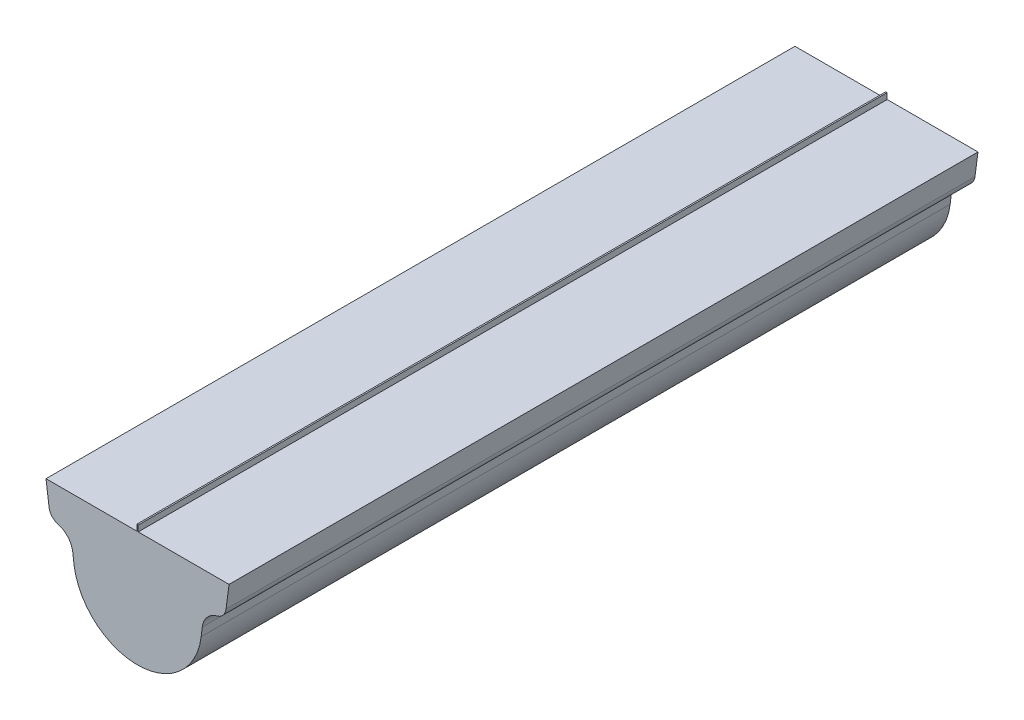
ISO-10303-21;
HEADER;
FILE_DESCRIPTION(('STEP AP214'),'2;1');
FILE_NAME('part.step','',(''),(''),'','','');
FILE_SCHEMA(('AUTOMOTIVE_DESIGN { 1 0 10303 214 1 1 1 1 }'));
ENDSEC;
DATA;
#1=APPLICATION_CONTEXT('core data for automotive mechanical design processes');
#2=APPLICATION_PROTOCOL_DEFINITION('international standard','automotive_design',2000,#1);
#3=PRODUCT_CONTEXT('',#1,'mechanical');
#4=PRODUCT('Part','Part','',(#3));
#5=PRODUCT_RELATED_PRODUCT_CATEGORY('part','',(#4));
#6=PRODUCT_DEFINITION_FORMATION('','',#4);
#7=PRODUCT_DEFINITION_CONTEXT('part definition',#1,'design');
#8=PRODUCT_DEFINITION('design','',#6,#7);
#9=PRODUCT_DEFINITION_SHAPE('','',#8);
#10=(LENGTH_UNIT() NAMED_UNIT(*) SI_UNIT(.MILLI.,.METRE.));
#11=(NAMED_UNIT(*) PLANE_ANGLE_UNIT() SI_UNIT($,.RADIAN.));
#12=(NAMED_UNIT(*) SI_UNIT($,.STERADIAN.) SOLID_ANGLE_UNIT());
#13=UNCERTAINTY_MEASURE_WITH_UNIT(LENGTH_MEASURE(1.E-05),#10,'distance_accuracy_value','');
#14=(GEOMETRIC_REPRESENTATION_CONTEXT(3) GLOBAL_UNCERTAINTY_ASSIGNED_CONTEXT((#13)) GLOBAL_UNIT_ASSIGNED_CONTEXT((#10,
#11,#12)) REPRESENTATION_CONTEXT('',''));
#15=CARTESIAN_POINT('',(0.,0.,0.));
#16=DIRECTION('',(0.,0.,1.));
#17=DIRECTION('',(1.,0.,0.));
#18=AXIS2_PLACEMENT_3D('',#15,#16,#17);
#19=CARTESIAN_POINT('',(-3.38742569697851,-0.0519080876537091,15.));
#20=DIRECTION('',(0.,0.,-1.));
#21=DIRECTION('',(-1.,0.,0.));
#22=AXIS2_PLACEMENT_3D('',#19,#20,#21);
#23=CYLINDRICAL_SURFACE('',#22,0.800000000000125);
#24=CARTESIAN_POINT('',(-3.38742569697851,-0.0519080876537091,15.));
#25=DIRECTION('',(0.,0.,-1.));
#26=DIRECTION('',(1.,0.,0.));
#27=AXIS2_PLACEMENT_3D('',#24,#25,#26);
#28=CIRCLE('',#27,0.800000000000125);
#29=CARTESIAN_POINT('',(-3.17867999402172,0.720377631168849,15.));
#30=VERTEX_POINT('',#29);
#31=CARTESIAN_POINT('',(-2.59341523450823,0.0458026358516489,15.));
#32=VERTEX_POINT('',#31);
#33=EDGE_CURVE('E167',#30,#32,#28,.T.);
#34=ORIENTED_EDGE('',*,*,#33,.F.);
#35=DIRECTION('',(0.,0.,-1.));
#36=VECTOR('',#35,1.);
#37=CARTESIAN_POINT('',(-3.17867999402172,0.720377631168849,15.));
#38=LINE('',#37,#36);
#39=CARTESIAN_POINT('',(-3.17867999402172,0.720377631168849,-15.));
#40=VERTEX_POINT('',#39);
#41=EDGE_CURVE('E196',#30,#40,#38,.T.);
#42=ORIENTED_EDGE('',*,*,#41,.T.);
#43=CARTESIAN_POINT('',(-3.38742569697851,-0.0519080876537091,-15.));
#44=DIRECTION('',(0.,0.,-1.));
#45=DIRECTION('',(1.,0.,0.));
#46=AXIS2_PLACEMENT_3D('',#43,#44,#45);
#47=CIRCLE('',#46,0.800000000000125);
#48=CARTESIAN_POINT('',(-2.59341523450823,0.0458026358516489,-15.));
#49=VERTEX_POINT('',#48);
#50=EDGE_CURVE('E193',#40,#49,#47,.T.);
#51=ORIENTED_EDGE('',*,*,#50,.T.);
#52=DIRECTION('',(0.,0.,-1.));
#53=VECTOR('',#52,1.);
#54=CARTESIAN_POINT('',(-2.59341523450823,0.0458026358516489,15.));
#55=LINE('',#54,#53);
#56=EDGE_CURVE('E185',#32,#49,#55,.T.);
#57=ORIENTED_EDGE('',*,*,#56,.F.);
#58=EDGE_LOOP('',(#34,#42,#51,#57));
#59=FACE_BOUND('',#58,.T.);
#60=ADVANCED_FACE('F39',(#59),#23,.F.);
#61=CARTESIAN_POINT('',(-2.59341523450823,0.0458026358516489,15.));
#62=DIRECTION('',(0.992513078087688,0.122138404381679,0.));
#63=DIRECTION('',(-0.122138404381679,0.992513078087688,0.));
#64=AXIS2_PLACEMENT_3D('',#61,#62,#63);
#65=PLANE('',#64);
#66=DIRECTION('',(0.122138404381679,-0.992513078087688,0.));
#67=VECTOR('',#66,1.);
#68=CARTESIAN_POINT('',(-2.59341523450823,0.0458026358516489,-15.));
#69=LINE('',#68,#67);
#70=CARTESIAN_POINT('',(-2.53832302564794,-0.401884052634221,-15.));
#71=VERTEX_POINT('',#70);
#72=EDGE_CURVE('E303',#49,#71,#69,.T.);
#73=ORIENTED_EDGE('',*,*,#72,.T.);
#74=DIRECTION('',(0.,0.,-1.));
#75=VECTOR('',#74,1.);
#76=CARTESIAN_POINT('',(-2.53832302564794,-0.401884052634221,15.));
#77=LINE('',#76,#75);
#78=CARTESIAN_POINT('',(-2.53832302564794,-0.401884052634221,15.));
#79=VERTEX_POINT('',#78);
#80=EDGE_CURVE('E187',#79,#71,#77,.T.);
#81=ORIENTED_EDGE('',*,*,#80,.F.);
#82=DIRECTION('',(0.122138404381679,-0.992513078087688,0.));
#83=VECTOR('',#82,1.);
#84=CARTESIAN_POINT('',(-2.59341523450823,0.0458026358516489,15.));
#85=LINE('',#84,#83);
#86=EDGE_CURVE('E171',#32,#79,#85,.T.);
#87=ORIENTED_EDGE('',*,*,#86,.F.);
#88=ORIENTED_EDGE('',*,*,#56,.T.);
#89=EDGE_LOOP('',(#73,#81,#87,#88));
#90=FACE_BOUND('',#89,.T.);
#91=ADVANCED_FACE('F184',(#90),#65,.F.);
#92=CARTESIAN_POINT('',(6.01650986206519E-05,-1.84460906226725E-08,15.));
#93=DIRECTION('',(0.,0.,-1.));
#94=DIRECTION('',(-1.,0.,0.));
#95=AXIS2_PLACEMENT_3D('',#92,#93,#94);
#96=CYLINDRICAL_SURFACE('',#95,2.57);
#97=CARTESIAN_POINT('',(6.01650986206519E-05,-1.84460906226725E-08,-15.));
#98=DIRECTION('',(0.,0.,1.));
#99=DIRECTION('',(1.,0.,0.));
#100=AXIS2_PLACEMENT_3D('',#97,#98,#99);
#101=CIRCLE('',#100,2.57);
#102=CARTESIAN_POINT('',(2.55098858639411,-0.312512721270984,-15.));
#103=VERTEX_POINT('',#102);
#104=EDGE_CURVE('E301',#71,#103,#101,.T.);
#105=ORIENTED_EDGE('',*,*,#104,.T.);
#106=DIRECTION('',(0.,0.,-1.));
#107=VECTOR('',#106,1.);
#108=CARTESIAN_POINT('',(2.55098858639411,-0.312512721270984,15.));
#109=LINE('',#108,#107);
#110=CARTESIAN_POINT('',(2.55098858639411,-0.312512721270984,15.));
#111=VERTEX_POINT('',#110);
#112=EDGE_CURVE('E202',#111,#103,#109,.T.);
#113=ORIENTED_EDGE('',*,*,#112,.F.);
#114=CARTESIAN_POINT('',(6.01650986206519E-05,-1.84460906226725E-08,15.));
#115=DIRECTION('',(0.,0.,1.));
#116=DIRECTION('',(1.,0.,0.));
#117=AXIS2_PLACEMENT_3D('',#114,#115,#116);
#118=CIRCLE('',#117,2.57);
#119=EDGE_CURVE('E190',#79,#111,#118,.T.);
#120=ORIENTED_EDGE('',*,*,#119,.F.);
#121=ORIENTED_EDGE('',*,*,#80,.T.);
#122=EDGE_LOOP('',(#105,#113,#120,#121));
#123=FACE_BOUND('',#122,.T.);
#124=ADVANCED_FACE('F333',(#123),#96,.T.);
#125=CARTESIAN_POINT('',(2.55098858639411,-0.312512721270984,15.));
#126=DIRECTION('',(-0.992579152255181,0.121600273471676,0.));
#127=DIRECTION('',(-0.121600273471676,-0.992579152255181,0.));
#128=AXIS2_PLACEMENT_3D('',#125,#126,#127);
#129=PLANE('',#128);
#130=DIRECTION('',(0.121600273471676,0.992579152255181,0.));
#131=VECTOR('',#130,1.);
#132=CARTESIAN_POINT('',(2.55098858639411,-0.312512721270984,-15.));
#133=LINE('',#132,#131);
#134=CARTESIAN_POINT('',(2.59483284387605,0.0453721311246856,-15.));
#135=VERTEX_POINT('',#134);
#136=EDGE_CURVE('E243',#103,#135,#133,.T.);
#137=ORIENTED_EDGE('',*,*,#136,.T.);
#138=DIRECTION('',(0.,0.,-1.));
#139=VECTOR('',#138,1.);
#140=CARTESIAN_POINT('',(2.59483284387605,0.0453721311246856,15.));
#141=LINE('',#140,#139);
#142=CARTESIAN_POINT('',(2.59483284387605,0.0453721311246856,15.));
#143=VERTEX_POINT('',#142);
#144=EDGE_CURVE('E286',#143,#135,#141,.T.);
#145=ORIENTED_EDGE('',*,*,#144,.F.);
#146=DIRECTION('',(0.121600273471676,0.992579152255181,0.));
#147=VECTOR('',#146,1.);
#148=CARTESIAN_POINT('',(2.55098858639411,-0.312512721270984,15.));
#149=LINE('',#148,#147);
#150=EDGE_CURVE('E298',#111,#143,#149,.T.);
#151=ORIENTED_EDGE('',*,*,#150,.F.);
#152=ORIENTED_EDGE('',*,*,#112,.T.);
#153=EDGE_LOOP('',(#137,#145,#151,#152));
#154=FACE_BOUND('',#153,.T.);
#155=ADVANCED_FACE('F296',(#154),#129,.F.);
#156=CARTESIAN_POINT('',(3.38889616568016,-0.0519080876534886,15.));
#157=DIRECTION('',(0.,0.,-1.));
#158=DIRECTION('',(-1.,0.,0.));
#159=AXIS2_PLACEMENT_3D('',#156,#157,#158);
#160=CYLINDRICAL_SURFACE('',#159,0.800000000000069);
#161=CARTESIAN_POINT('',(3.38889616568016,-0.0519080876534886,-15.));
#162=DIRECTION('',(0.,0.,-1.));
#163=DIRECTION('',(1.,0.,0.));
#164=AXIS2_PLACEMENT_3D('',#161,#162,#163);
#165=CIRCLE('',#164,0.800000000000069);
#166=CARTESIAN_POINT('',(3.18015046256572,0.7203776311264,-15.));
#167=VERTEX_POINT('',#166);
#168=EDGE_CURVE('E236',#135,#167,#165,.T.);
#169=ORIENTED_EDGE('',*,*,#168,.T.);
#170=DIRECTION('',(0.,0.,-1.));
#171=VECTOR('',#170,1.);
#172=CARTESIAN_POINT('',(3.18015046256572,0.7203776311264,15.));
#173=LINE('',#172,#171);
#174=CARTESIAN_POINT('',(3.18015046256572,0.7203776311264,15.));
#175=VERTEX_POINT('',#174);
#176=EDGE_CURVE('E11',#167,#175,#173,.F.);
#177=ORIENTED_EDGE('',*,*,#176,.T.);
#178=CARTESIAN_POINT('',(3.38889616568016,-0.0519080876534886,15.));
#179=DIRECTION('',(0.,0.,-1.));
#180=DIRECTION('',(1.,0.,0.));
#181=AXIS2_PLACEMENT_3D('',#178,#179,#180);
#182=CIRCLE('',#181,0.800000000000069);
#183=EDGE_CURVE('E328',#143,#175,#182,.T.);
#184=ORIENTED_EDGE('',*,*,#183,.F.);
#185=ORIENTED_EDGE('',*,*,#144,.T.);
#186=EDGE_LOOP('',(#169,#177,#184,#185));
#187=FACE_BOUND('',#186,.T.);
#188=ADVANCED_FACE('F340',(#187),#160,.F.);
#189=CARTESIAN_POINT('',(3.49324079305458,0.741257846270935,15.));
#190=DIRECTION('',(-0.991457417380456,0.130430784407962,0.));
#191=DIRECTION('',(-0.130430784407962,-0.991457417380456,0.));
#192=AXIS2_PLACEMENT_3D('',#189,#190,#191);
#193=PLANE('',#192);
#194=DIRECTION('',(0.130430784407962,0.991457417380456,0.));
#195=VECTOR('',#194,1.);
#196=CARTESIAN_POINT('',(3.49324079305458,0.741257846270935,15.));
#197=LINE('',#196,#195);
#198=CARTESIAN_POINT('',(3.54541310680944,1.13784081315981,15.));
#199=VERTEX_POINT('',#198);
#200=CARTESIAN_POINT('',(3.66671373631566,2.05989621137545,15.));
#201=VERTEX_POINT('',#200);
#202=EDGE_CURVE('E227',#199,#201,#197,.T.);
#203=ORIENTED_EDGE('',*,*,#202,.F.);
#204=DIRECTION('',(0.,0.,-1.));
#205=VECTOR('',#204,1.);
#206=CARTESIAN_POINT('',(3.54541310680944,1.13784081315981,15.));
#207=LINE('',#206,#205);
#208=CARTESIAN_POINT('',(3.54541310680944,1.13784081315981,-15.));
#209=VERTEX_POINT('',#208);
#210=EDGE_CURVE('E48',#199,#209,#207,.T.);
#211=ORIENTED_EDGE('',*,*,#210,.T.);
#212=DIRECTION('',(0.130430784407962,0.991457417380456,0.));
#213=VECTOR('',#212,1.);
#214=CARTESIAN_POINT('',(3.49324079305458,0.741257846270935,-15.));
#215=LINE('',#214,#213);
#216=CARTESIAN_POINT('',(3.66671373631566,2.05989621137545,-15.));
#217=VERTEX_POINT('',#216);
#218=EDGE_CURVE('E225',#209,#217,#215,.T.);
#219=ORIENTED_EDGE('',*,*,#218,.T.);
#220=DIRECTION('',(0.,0.,-1.));
#221=VECTOR('',#220,1.);
#222=CARTESIAN_POINT('',(3.66671373631566,2.05989621137545,15.));
#223=LINE('',#222,#221);
#224=EDGE_CURVE('E283',#201,#217,#223,.T.);
#225=ORIENTED_EDGE('',*,*,#224,.F.);
#226=EDGE_LOOP('',(#203,#211,#219,#225));
#227=FACE_BOUND('',#226,.T.);
#228=ADVANCED_FACE('F223',(#227),#193,.F.);
#229=CARTESIAN_POINT('',(0.0289371754169424,2.05989621137086,15.));
#230=DIRECTION('',(1.26106597132159E-12,-1.,0.));
#231=DIRECTION('',(1.,1.26106597132159E-12,0.));
#232=AXIS2_PLACEMENT_3D('',#229,#230,#231);
#233=PLANE('',#232);
#234=DIRECTION('',(-1.,-1.26106597132159E-12,0.));
#235=VECTOR('',#234,1.);
#236=CARTESIAN_POINT('',(0.0289371754169424,2.05989621137086,-15.));
#237=LINE('',#236,#235);
#238=CARTESIAN_POINT('',(0.0289371754169424,2.05989621137086,-15.));
#239=VERTEX_POINT('',#238);
#240=EDGE_CURVE('E234',#217,#239,#237,.T.);
#241=ORIENTED_EDGE('',*,*,#240,.T.);
#242=DIRECTION('',(0.,0.,-1.));
#243=VECTOR('',#242,1.);
#244=CARTESIAN_POINT('',(0.0289371754169424,2.05989621137086,15.));
#245=LINE('',#244,#243);
#246=CARTESIAN_POINT('',(0.0289371754169424,2.05989621137086,15.));
#247=VERTEX_POINT('',#246);
#248=EDGE_CURVE('E279',#247,#239,#245,.T.);
#249=ORIENTED_EDGE('',*,*,#248,.F.);
#250=DIRECTION('',(-1.,-1.26106597132159E-12,0.));
#251=VECTOR('',#250,1.);
#252=CARTESIAN_POINT('',(0.0289371754169424,2.05989621137086,15.));
#253=LINE('',#252,#251);
#254=EDGE_CURVE('E324',#201,#247,#253,.T.);
#255=ORIENTED_EDGE('',*,*,#254,.F.);
#256=ORIENTED_EDGE('',*,*,#224,.T.);
#257=EDGE_LOOP('',(#241,#249,#255,#256));
#258=FACE_BOUND('',#257,.T.);
#259=ADVANCED_FACE('F381',(#258),#233,.F.);
#260=CARTESIAN_POINT('',(0.0289371754169424,2.25871257688882,15.));
#261=DIRECTION('',(-1.,0.,0.));
#262=DIRECTION('',(0.,0.,1.));
#263=AXIS2_PLACEMENT_3D('',#260,#261,#262);
#264=PLANE('',#263);
#265=DIRECTION('',(0.,1.,0.));
#266=VECTOR('',#265,1.);
#267=CARTESIAN_POINT('',(0.0289371754169424,2.25871257688882,-15.));
#268=LINE('',#267,#266);
#269=CARTESIAN_POINT('',(0.0289371754169424,2.2999858416259,-15.));
#270=VERTEX_POINT('',#269);
#271=EDGE_CURVE('E240',#239,#270,#268,.T.);
#272=ORIENTED_EDGE('',*,*,#271,.T.);
#273=DIRECTION('',(0.,0.,-1.));
#274=VECTOR('',#273,1.);
#275=CARTESIAN_POINT('',(0.0289371754169424,2.2999858416259,15.));
#276=LINE('',#275,#274);
#277=CARTESIAN_POINT('',(0.0289371754169424,2.2999858416259,15.));
#278=VERTEX_POINT('',#277);
#279=EDGE_CURVE('E275',#278,#270,#276,.T.);
#280=ORIENTED_EDGE('',*,*,#279,.F.);
#281=DIRECTION('',(0.,1.,0.));
#282=VECTOR('',#281,1.);
#283=CARTESIAN_POINT('',(0.0289371754169424,2.25871257688882,15.));
#284=LINE('',#283,#282);
#285=EDGE_CURVE('E321',#247,#278,#284,.T.);
#286=ORIENTED_EDGE('',*,*,#285,.F.);
#287=ORIENTED_EDGE('',*,*,#248,.T.);
#288=EDGE_LOOP('',(#272,#280,#286,#287));
#289=FACE_BOUND('',#288,.T.);
#290=ADVANCED_FACE('F379',(#289),#264,.F.);
#291=CARTESIAN_POINT('',(0.0289371754169424,2.2999858416259,15.));
#292=DIRECTION('',(0.,-1.,0.));
#293=DIRECTION('',(0.,0.,-1.));
#294=AXIS2_PLACEMENT_3D('',#291,#292,#293);
#295=PLANE('',#294);
#296=DIRECTION('',(-1.,0.,0.));
#297=VECTOR('',#296,1.);
#298=CARTESIAN_POINT('',(0.0289371754169424,2.2999858416259,-15.));
#299=LINE('',#298,#297);
#300=CARTESIAN_POINT('',(-0.027466706894234,2.2999858416259,-15.));
#301=VERTEX_POINT('',#300);
#302=EDGE_CURVE('E249',#270,#301,#299,.T.);
#303=ORIENTED_EDGE('',*,*,#302,.T.);
#304=DIRECTION('',(0.,0.,-1.));
#305=VECTOR('',#304,1.);
#306=CARTESIAN_POINT('',(-0.027466706894234,2.2999858416259,15.));
#307=LINE('',#306,#305);
#308=CARTESIAN_POINT('',(-0.027466706894234,2.2999858416259,15.));
#309=VERTEX_POINT('',#308);
#310=EDGE_CURVE('E271',#309,#301,#307,.T.);
#311=ORIENTED_EDGE('',*,*,#310,.F.);
#312=DIRECTION('',(-1.,0.,0.));
#313=VECTOR('',#312,1.);
#314=CARTESIAN_POINT('',(0.0289371754169424,2.2999858416259,15.));
#315=LINE('',#314,#313);
#316=EDGE_CURVE('E318',#278,#309,#315,.T.);
#317=ORIENTED_EDGE('',*,*,#316,.F.);
#318=ORIENTED_EDGE('',*,*,#279,.T.);
#319=EDGE_LOOP('',(#303,#311,#317,#318));
#320=FACE_BOUND('',#319,.T.);
#321=ADVANCED_FACE('F370',(#320),#295,.F.);
#322=CARTESIAN_POINT('',(-0.027466706894234,2.25871257689349,15.));
#323=DIRECTION('',(1.,0.,0.));
#324=DIRECTION('',(0.,0.,-1.));
#325=AXIS2_PLACEMENT_3D('',#322,#323,#324);
#326=PLANE('',#325);
#327=DIRECTION('',(0.,-1.,0.));
#328=VECTOR('',#327,1.);
#329=CARTESIAN_POINT('',(-0.027466706894234,2.25871257689349,-15.));
#330=LINE('',#329,#328);
#331=CARTESIAN_POINT('',(-0.027466706894234,2.05989621137079,-15.));
#332=VERTEX_POINT('',#331);
#333=EDGE_CURVE('E253',#301,#332,#330,.T.);
#334=ORIENTED_EDGE('',*,*,#333,.T.);
#335=DIRECTION('',(0.,0.,-1.));
#336=VECTOR('',#335,1.);
#337=CARTESIAN_POINT('',(-0.027466706894234,2.05989621137079,15.));
#338=LINE('',#337,#336);
#339=CARTESIAN_POINT('',(-0.027466706894234,2.05989621137079,15.));
#340=VERTEX_POINT('',#339);
#341=EDGE_CURVE('E266',#340,#332,#338,.T.);
#342=ORIENTED_EDGE('',*,*,#341,.F.);
#343=DIRECTION('',(0.,-1.,0.));
#344=VECTOR('',#343,1.);
#345=CARTESIAN_POINT('',(-0.027466706894234,2.2999858416259,15.));
#346=LINE('',#345,#344);
#347=EDGE_CURVE('E315',#309,#340,#346,.T.);
#348=ORIENTED_EDGE('',*,*,#347,.F.);
#349=ORIENTED_EDGE('',*,*,#310,.T.);
#350=EDGE_LOOP('',(#334,#342,#348,#349));
#351=FACE_BOUND('',#350,.T.);
#352=ADVANCED_FACE('F374',(#351),#326,.F.);
#353=CARTESIAN_POINT('',(-3.66524326786224,2.05989621136633,15.));
#354=DIRECTION('',(1.22518198024439E-12,-1.,0.));
#355=DIRECTION('',(1.,1.22518198024439E-12,0.));
#356=AXIS2_PLACEMENT_3D('',#353,#354,#355);
#357=PLANE('',#356);
#358=DIRECTION('',(-1.,-1.22518198024439E-12,0.));
#359=VECTOR('',#358,1.);
#360=CARTESIAN_POINT('',(-3.66524326786224,2.05989621136633,-15.));
#361=LINE('',#360,#359);
#362=CARTESIAN_POINT('',(-3.66524326786224,2.05989621136633,-15.));
#363=VERTEX_POINT('',#362);
#364=EDGE_CURVE('E256',#332,#363,#361,.T.);
#365=ORIENTED_EDGE('',*,*,#364,.T.);
#366=DIRECTION('',(0.,0.,-1.));
#367=VECTOR('',#366,1.);
#368=CARTESIAN_POINT('',(-3.66524326786224,2.05989621136633,15.));
#369=LINE('',#368,#367);
#370=CARTESIAN_POINT('',(-3.66524326786224,2.05989621136633,15.));
#371=VERTEX_POINT('',#370);
#372=EDGE_CURVE('E262',#371,#363,#369,.T.);
#373=ORIENTED_EDGE('',*,*,#372,.F.);
#374=DIRECTION('',(-1.,-1.22518198024439E-12,0.));
#375=VECTOR('',#374,1.);
#376=CARTESIAN_POINT('',(-3.66524326786224,2.05989621136633,15.));
#377=LINE('',#376,#375);
#378=EDGE_CURVE('E312',#340,#371,#377,.T.);
#379=ORIENTED_EDGE('',*,*,#378,.F.);
#380=ORIENTED_EDGE('',*,*,#341,.T.);
#381=EDGE_LOOP('',(#365,#373,#379,#380));
#382=FACE_BOUND('',#381,.T.);
#383=ADVANCED_FACE('F364',(#382),#357,.F.);
#384=CARTESIAN_POINT('',(-3.49177032459481,0.74125784623895,15.));
#385=DIRECTION('',(0.991457417380131,0.130430784410428,0.));
#386=DIRECTION('',(-0.130430784410428,0.991457417380132,0.));
#387=AXIS2_PLACEMENT_3D('',#384,#385,#386);
#388=PLANE('',#387);
#389=DIRECTION('',(0.130430784410428,-0.991457417380132,0.));
#390=VECTOR('',#389,1.);
#391=CARTESIAN_POINT('',(-3.49177032459481,0.74125784623895,-15.));
#392=LINE('',#391,#390);
#393=CARTESIAN_POINT('',(-3.54394263836381,1.13784081322766,-15.));
#394=VERTEX_POINT('',#393);
#395=EDGE_CURVE('E180',#363,#394,#392,.T.);
#396=ORIENTED_EDGE('',*,*,#395,.T.);
#397=DIRECTION('',(0.,0.,-1.));
#398=VECTOR('',#397,1.);
#399=CARTESIAN_POINT('',(-3.54394263836381,1.13784081322766,15.));
#400=LINE('',#399,#398);
#401=CARTESIAN_POINT('',(-3.54394263836381,1.13784081322766,15.));
#402=VERTEX_POINT('',#401);
#403=EDGE_CURVE('E211',#394,#402,#400,.F.);
#404=ORIENTED_EDGE('',*,*,#403,.T.);
#405=DIRECTION('',(0.130430784410428,-0.991457417380132,0.));
#406=VECTOR('',#405,1.);
#407=CARTESIAN_POINT('',(-3.49177032459481,0.74125784623895,15.));
#408=LINE('',#407,#406);
#409=EDGE_CURVE('E267',#371,#402,#408,.T.);
#410=ORIENTED_EDGE('',*,*,#409,.F.);
#411=ORIENTED_EDGE('',*,*,#372,.T.);
#412=EDGE_LOOP('',(#396,#404,#410,#411));
#413=FACE_BOUND('',#412,.T.);
#414=ADVANCED_FACE('F359',(#413),#388,.F.);
#415=CARTESIAN_POINT('',(-3.38742569697851,-0.0519080876537091,15.));
#416=DIRECTION('',(0.,0.,1.));
#417=DIRECTION('',(1.,0.,0.));
#418=AXIS2_PLACEMENT_3D('',#415,#416,#417);
#419=PLANE('',#418);
#420=ORIENTED_EDGE('',*,*,#409,.T.);
#421=CARTESIAN_POINT('',(-3.04821392967374,1.20305620543287,15.));
#422=DIRECTION('',(0.,0.,1.));
#423=DIRECTION('',(1.,0.,0.));
#424=AXIS2_PLACEMENT_3D('',#421,#422,#423);
#425=CIRCLE('',#424,0.5);
#426=EDGE_CURVE('E174',#402,#30,#425,.T.);
#427=ORIENTED_EDGE('',*,*,#426,.T.);
#428=ORIENTED_EDGE('',*,*,#33,.T.);
#429=ORIENTED_EDGE('',*,*,#86,.T.);
#430=ORIENTED_EDGE('',*,*,#119,.T.);
#431=ORIENTED_EDGE('',*,*,#150,.T.);
#432=ORIENTED_EDGE('',*,*,#183,.T.);
#433=CARTESIAN_POINT('',(3.04968439811921,1.20305620536379,15.));
#434=DIRECTION('',(0.,0.,1.));
#435=DIRECTION('',(1.,0.,0.));
#436=AXIS2_PLACEMENT_3D('',#433,#434,#435);
#437=CIRCLE('',#436,0.5);
#438=EDGE_CURVE('E58',#175,#199,#437,.T.);
#439=ORIENTED_EDGE('',*,*,#438,.T.);
#440=ORIENTED_EDGE('',*,*,#202,.T.);
#441=ORIENTED_EDGE('',*,*,#254,.T.);
#442=ORIENTED_EDGE('',*,*,#285,.T.);
#443=ORIENTED_EDGE('',*,*,#316,.T.);
#444=ORIENTED_EDGE('',*,*,#347,.T.);
#445=ORIENTED_EDGE('',*,*,#378,.T.);
#446=EDGE_LOOP('',(#420,#427,#428,#429,#430,#431,#432,#439,#440,#441,#442,#443,#444,#445));
#447=FACE_BOUND('',#446,.T.);
#448=ADVANCED_FACE('F170',(#447),#419,.T.);
#449=CARTESIAN_POINT('',(-3.38742569697851,-0.0519080876537091,-15.));
#450=DIRECTION('',(0.,0.,1.));
#451=DIRECTION('',(1.,0.,0.));
#452=AXIS2_PLACEMENT_3D('',#449,#450,#451);
#453=PLANE('',#452);
#454=ORIENTED_EDGE('',*,*,#50,.F.);
#455=CARTESIAN_POINT('',(-3.04821392967374,1.20305620543287,-15.));
#456=DIRECTION('',(0.,0.,1.));
#457=DIRECTION('',(1.,0.,0.));
#458=AXIS2_PLACEMENT_3D('',#455,#456,#457);
#459=CIRCLE('',#458,0.5);
#460=EDGE_CURVE('E208',#40,#394,#459,.F.);
#461=ORIENTED_EDGE('',*,*,#460,.T.);
#462=ORIENTED_EDGE('',*,*,#395,.F.);
#463=ORIENTED_EDGE('',*,*,#364,.F.);
#464=ORIENTED_EDGE('',*,*,#333,.F.);
#465=ORIENTED_EDGE('',*,*,#302,.F.);
#466=ORIENTED_EDGE('',*,*,#271,.F.);
#467=ORIENTED_EDGE('',*,*,#240,.F.);
#468=ORIENTED_EDGE('',*,*,#218,.F.);
#469=CARTESIAN_POINT('',(3.04968439811921,1.20305620536379,-15.));
#470=DIRECTION('',(0.,0.,1.));
#471=DIRECTION('',(1.,0.,0.));
#472=AXIS2_PLACEMENT_3D('',#469,#470,#471);
#473=CIRCLE('',#472,0.5);
#474=EDGE_CURVE('E200',#209,#167,#473,.F.);
#475=ORIENTED_EDGE('',*,*,#474,.T.);
#476=ORIENTED_EDGE('',*,*,#168,.F.);
#477=ORIENTED_EDGE('',*,*,#136,.F.);
#478=ORIENTED_EDGE('',*,*,#104,.F.);
#479=ORIENTED_EDGE('',*,*,#72,.F.);
#480=EDGE_LOOP('',(#454,#461,#462,#463,#464,#465,#466,#467,#468,#475,#476,#477,#478,#479));
#481=FACE_BOUND('',#480,.T.);
#482=ADVANCED_FACE('F231',(#481),#453,.F.);
#483=CARTESIAN_POINT('',(-3.04821392967374,1.20305620543287,15.));
#484=DIRECTION('',(0.,0.,-1.));
#485=DIRECTION('',(-1.,0.,0.));
#486=AXIS2_PLACEMENT_3D('',#483,#484,#485);
#487=CYLINDRICAL_SURFACE('',#486,0.5);
#488=ORIENTED_EDGE('',*,*,#426,.F.);
#489=ORIENTED_EDGE('',*,*,#403,.F.);
#490=ORIENTED_EDGE('',*,*,#460,.F.);
#491=ORIENTED_EDGE('',*,*,#41,.F.);
#492=EDGE_LOOP('',(#488,#489,#490,#491));
#493=FACE_BOUND('',#492,.T.);
#494=ADVANCED_FACE('F347',(#493),#487,.T.);
#495=CARTESIAN_POINT('',(3.04968439811921,1.20305620536379,15.));
#496=DIRECTION('',(0.,0.,-1.));
#497=DIRECTION('',(-1.,0.,0.));
#498=AXIS2_PLACEMENT_3D('',#495,#496,#497);
#499=CYLINDRICAL_SURFACE('',#498,0.5);
#500=ORIENTED_EDGE('',*,*,#438,.F.);
#501=ORIENTED_EDGE('',*,*,#176,.F.);
#502=ORIENTED_EDGE('',*,*,#474,.F.);
#503=ORIENTED_EDGE('',*,*,#210,.F.);
#504=EDGE_LOOP('',(#500,#501,#502,#503));
#505=FACE_BOUND('',#504,.T.);
#506=ADVANCED_FACE('F41',(#505),#499,.T.);
#507=CLOSED_SHELL('',(#60,#91,#124,#155,#188,#228,#259,#290,#321,#352,#383,#414,#448,#482,#494,#506));
#508=MANIFOLD_SOLID_BREP('B2',#507);
#509=ADVANCED_BREP_SHAPE_REPRESENTATION('',(#18,#508),#14);
#510=SHAPE_DEFINITION_REPRESENTATION(#9,#509);
ENDSEC;
END-ISO-10303-21;
